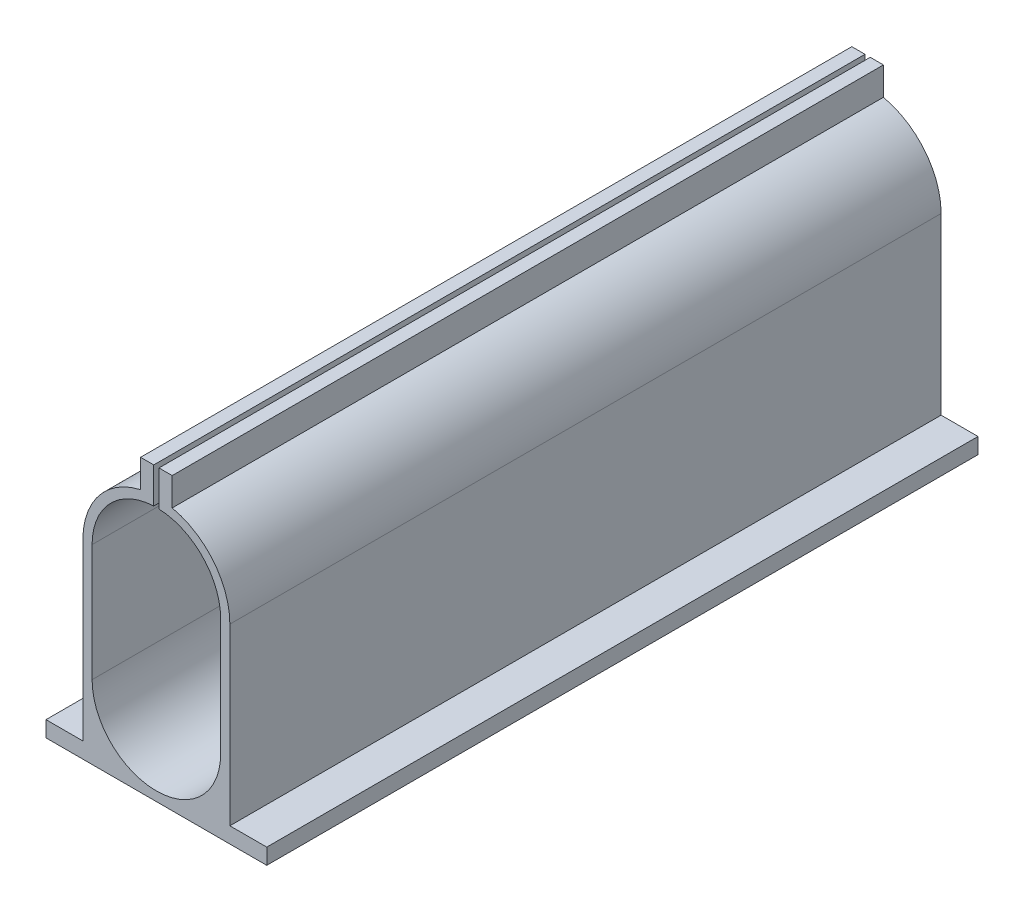
ISO-10303-21;
HEADER;
FILE_DESCRIPTION(('STEP AP214'),'2;1');
FILE_NAME('part.step','',(''),(''),'','','');
FILE_SCHEMA(('AUTOMOTIVE_DESIGN { 1 0 10303 214 1 1 1 1 }'));
ENDSEC;
DATA;
#1=APPLICATION_CONTEXT('core data for automotive mechanical design processes');
#2=APPLICATION_PROTOCOL_DEFINITION('international standard','automotive_design',2000,#1);
#3=PRODUCT_CONTEXT('',#1,'mechanical');
#4=PRODUCT('Part','Part','',(#3));
#5=PRODUCT_RELATED_PRODUCT_CATEGORY('part','',(#4));
#6=PRODUCT_DEFINITION_FORMATION('','',#4);
#7=PRODUCT_DEFINITION_CONTEXT('part definition',#1,'design');
#8=PRODUCT_DEFINITION('design','',#6,#7);
#9=PRODUCT_DEFINITION_SHAPE('','',#8);
#10=(LENGTH_UNIT() NAMED_UNIT(*) SI_UNIT(.MILLI.,.METRE.));
#11=(NAMED_UNIT(*) PLANE_ANGLE_UNIT() SI_UNIT($,.RADIAN.));
#12=(NAMED_UNIT(*) SI_UNIT($,.STERADIAN.) SOLID_ANGLE_UNIT());
#13=UNCERTAINTY_MEASURE_WITH_UNIT(LENGTH_MEASURE(1.E-05),#10,'distance_accuracy_value','');
#14=(GEOMETRIC_REPRESENTATION_CONTEXT(3) GLOBAL_UNCERTAINTY_ASSIGNED_CONTEXT((#13)) GLOBAL_UNIT_ASSIGNED_CONTEXT((#10,
#11,#12)) REPRESENTATION_CONTEXT('',''));
#15=CARTESIAN_POINT('',(0.,0.,0.));
#16=DIRECTION('',(0.,0.,1.));
#17=DIRECTION('',(1.,0.,0.));
#18=AXIS2_PLACEMENT_3D('',#15,#16,#17);
#19=CARTESIAN_POINT('',(0.,11.1,67.5));
#20=DIRECTION('',(0.,0.,-1.));
#21=DIRECTION('',(-1.,0.,0.));
#22=AXIS2_PLACEMENT_3D('',#19,#20,#21);
#23=CYLINDRICAL_SURFACE('',#22,12.2);
#24=DIRECTION('',(0.,0.,-1.));
#25=VECTOR('',#24,1.);
#26=CARTESIAN_POINT('',(-0.499999999999998,23.289749792346,67.5));
#27=LINE('',#26,#25);
#28=CARTESIAN_POINT('',(-0.499999999999998,23.289749792346,67.5));
#29=VERTEX_POINT('',#28);
#30=CARTESIAN_POINT('',(-0.499999999999998,23.289749792346,-64.5));
#31=VERTEX_POINT('',#30);
#32=EDGE_CURVE('E223',#29,#31,#27,.T.);
#33=ORIENTED_EDGE('',*,*,#32,.F.);
#34=CARTESIAN_POINT('',(0.,11.1,67.5));
#35=DIRECTION('',(0.,0.,1.));
#36=DIRECTION('',(1.,0.,0.));
#37=AXIS2_PLACEMENT_3D('',#34,#35,#36);
#38=CIRCLE('',#37,12.2);
#39=CARTESIAN_POINT('',(-12.2,11.1,67.5));
#40=VERTEX_POINT('',#39);
#41=EDGE_CURVE('E261',#29,#40,#38,.T.);
#42=ORIENTED_EDGE('',*,*,#41,.T.);
#43=DIRECTION('',(0.,0.,-1.));
#44=VECTOR('',#43,1.);
#45=CARTESIAN_POINT('',(-12.2,11.1,67.5));
#46=LINE('',#45,#44);
#47=CARTESIAN_POINT('',(-12.2,11.1,-64.5));
#48=VERTEX_POINT('',#47);
#49=EDGE_CURVE('E270',#40,#48,#46,.T.);
#50=ORIENTED_EDGE('',*,*,#49,.T.);
#51=CARTESIAN_POINT('',(0.,11.1,-64.5));
#52=DIRECTION('',(0.,0.,-1.));
#53=DIRECTION('',(-1.,0.,0.));
#54=AXIS2_PLACEMENT_3D('',#51,#52,#53);
#55=CIRCLE('',#54,12.2);
#56=EDGE_CURVE('E248',#48,#31,#55,.T.);
#57=ORIENTED_EDGE('',*,*,#56,.T.);
#58=EDGE_LOOP('',(#33,#42,#50,#57));
#59=FACE_BOUND('',#58,.T.);
#60=ADVANCED_FACE('F33',(#59),#23,.F.);
#61=CARTESIAN_POINT('',(-3.,30.05,-76.5311959340942));
#62=DIRECTION('',(0.,1.,0.));
#63=DIRECTION('',(0.,0.,1.));
#64=AXIS2_PLACEMENT_3D('',#61,#62,#63);
#65=PLANE('',#64);
#66=DIRECTION('',(0.,0.,1.));
#67=VECTOR('',#66,1.);
#68=CARTESIAN_POINT('',(-0.499999999999997,30.05,-67.5));
#69=LINE('',#68,#67);
#70=CARTESIAN_POINT('',(-0.499999999999997,30.05,-67.5));
#71=VERTEX_POINT('',#70);
#72=CARTESIAN_POINT('',(-0.499999999999997,30.05,67.5));
#73=VERTEX_POINT('',#72);
#74=EDGE_CURVE('E212',#71,#73,#69,.T.);
#75=ORIENTED_EDGE('',*,*,#74,.F.);
#76=DIRECTION('',(1.,0.,0.));
#77=VECTOR('',#76,1.);
#78=CARTESIAN_POINT('',(-3.,30.05,-67.5));
#79=LINE('',#78,#77);
#80=CARTESIAN_POINT('',(-3.,30.05,-67.5));
#81=VERTEX_POINT('',#80);
#82=EDGE_CURVE('E205',#81,#71,#79,.T.);
#83=ORIENTED_EDGE('',*,*,#82,.F.);
#84=DIRECTION('',(0.,0.,1.));
#85=VECTOR('',#84,1.);
#86=CARTESIAN_POINT('',(-3.,30.05,-76.5311959340942));
#87=LINE('',#86,#85);
#88=CARTESIAN_POINT('',(-3.,30.05,67.5));
#89=VERTEX_POINT('',#88);
#90=EDGE_CURVE('E230',#81,#89,#87,.T.);
#91=ORIENTED_EDGE('',*,*,#90,.T.);
#92=DIRECTION('',(-1.,0.,0.));
#93=VECTOR('',#92,1.);
#94=CARTESIAN_POINT('',(-3.,30.05,67.5));
#95=LINE('',#94,#93);
#96=EDGE_CURVE('E239',#73,#89,#95,.T.);
#97=ORIENTED_EDGE('',*,*,#96,.F.);
#98=EDGE_LOOP('',(#75,#83,#91,#97));
#99=FACE_BOUND('',#98,.T.);
#100=ADVANCED_FACE('F349',(#99),#65,.T.);
#101=CARTESIAN_POINT('',(0.,11.1,67.5));
#102=DIRECTION('',(0.,0.,-1.));
#103=DIRECTION('',(-1.,0.,0.));
#104=AXIS2_PLACEMENT_3D('',#101,#102,#103);
#105=CYLINDRICAL_SURFACE('',#104,13.95);
#106=CARTESIAN_POINT('',(0.,11.1,67.5));
#107=DIRECTION('',(0.,0.,1.));
#108=DIRECTION('',(1.,0.,0.));
#109=AXIS2_PLACEMENT_3D('',#106,#107,#108);
#110=CIRCLE('',#109,13.95);
#111=CARTESIAN_POINT('',(-3.,24.7236008455914,67.5));
#112=VERTEX_POINT('',#111);
#113=CARTESIAN_POINT('',(-13.95,11.1,67.5));
#114=VERTEX_POINT('',#113);
#115=EDGE_CURVE('E56',#112,#114,#110,.T.);
#116=ORIENTED_EDGE('',*,*,#115,.F.);
#117=DIRECTION('',(0.,0.,-1.));
#118=VECTOR('',#117,1.);
#119=CARTESIAN_POINT('',(-3.,24.7236008455914,67.5));
#120=LINE('',#119,#118);
#121=CARTESIAN_POINT('',(-3.,24.7236008455914,-67.5));
#122=VERTEX_POINT('',#121);
#123=EDGE_CURVE('E41',#112,#122,#120,.T.);
#124=ORIENTED_EDGE('',*,*,#123,.T.);
#125=CARTESIAN_POINT('',(0.,11.1,-67.5));
#126=DIRECTION('',(0.,0.,1.));
#127=DIRECTION('',(1.,0.,0.));
#128=AXIS2_PLACEMENT_3D('',#125,#126,#127);
#129=CIRCLE('',#128,13.95);
#130=CARTESIAN_POINT('',(-13.95,11.1,-67.5));
#131=VERTEX_POINT('',#130);
#132=EDGE_CURVE('E279',#122,#131,#129,.T.);
#133=ORIENTED_EDGE('',*,*,#132,.T.);
#134=DIRECTION('',(0.,0.,-1.));
#135=VECTOR('',#134,1.);
#136=CARTESIAN_POINT('',(-13.95,11.1,67.5));
#137=LINE('',#136,#135);
#138=EDGE_CURVE('E334',#114,#131,#137,.T.);
#139=ORIENTED_EDGE('',*,*,#138,.F.);
#140=EDGE_LOOP('',(#116,#124,#133,#139));
#141=FACE_BOUND('',#140,.T.);
#142=ADVANCED_FACE('F342',(#141),#105,.T.);
#143=CARTESIAN_POINT('',(0.,-11.1,67.5));
#144=DIRECTION('',(0.,0.,-1.));
#145=DIRECTION('',(-1.,0.,0.));
#146=AXIS2_PLACEMENT_3D('',#143,#144,#145);
#147=CYLINDRICAL_SURFACE('',#146,12.2);
#148=DIRECTION('',(0.,0.,-1.));
#149=VECTOR('',#148,1.);
#150=CARTESIAN_POINT('',(12.2,-11.1,67.5));
#151=LINE('',#150,#149);
#152=CARTESIAN_POINT('',(12.2,-11.1,67.5));
#153=VERTEX_POINT('',#152);
#154=CARTESIAN_POINT('',(12.2,-11.1,-64.5));
#155=VERTEX_POINT('',#154);
#156=EDGE_CURVE('E276',#153,#155,#151,.T.);
#157=ORIENTED_EDGE('',*,*,#156,.T.);
#158=CARTESIAN_POINT('',(0.,-11.1,-64.5));
#159=DIRECTION('',(0.,0.,-1.));
#160=DIRECTION('',(-1.,0.,0.));
#161=AXIS2_PLACEMENT_3D('',#158,#159,#160);
#162=CIRCLE('',#161,12.2);
#163=CARTESIAN_POINT('',(-12.2,-11.1,-64.5));
#164=VERTEX_POINT('',#163);
#165=EDGE_CURVE('E254',#155,#164,#162,.T.);
#166=ORIENTED_EDGE('',*,*,#165,.T.);
#167=DIRECTION('',(0.,0.,-1.));
#168=VECTOR('',#167,1.);
#169=CARTESIAN_POINT('',(-12.2,-11.1,67.5));
#170=LINE('',#169,#168);
#171=CARTESIAN_POINT('',(-12.2,-11.1,67.5));
#172=VERTEX_POINT('',#171);
#173=EDGE_CURVE('E267',#172,#164,#170,.T.);
#174=ORIENTED_EDGE('',*,*,#173,.F.);
#175=CARTESIAN_POINT('',(0.,-11.1,67.5));
#176=DIRECTION('',(0.,0.,1.));
#177=DIRECTION('',(1.,0.,0.));
#178=AXIS2_PLACEMENT_3D('',#175,#176,#177);
#179=CIRCLE('',#178,12.2);
#180=EDGE_CURVE('E257',#172,#153,#179,.T.);
#181=ORIENTED_EDGE('',*,*,#180,.T.);
#182=EDGE_LOOP('',(#157,#166,#174,#181));
#183=FACE_BOUND('',#182,.T.);
#184=ADVANCED_FACE('F367',(#183),#147,.F.);
#185=CARTESIAN_POINT('',(12.2,-11.1,67.5));
#186=DIRECTION('',(-1.,0.,0.));
#187=DIRECTION('',(0.,-1.,0.));
#188=AXIS2_PLACEMENT_3D('',#185,#186,#187);
#189=PLANE('',#188);
#190=DIRECTION('',(0.,0.,-1.));
#191=VECTOR('',#190,1.);
#192=CARTESIAN_POINT('',(12.2,11.1,67.5));
#193=LINE('',#192,#191);
#194=CARTESIAN_POINT('',(12.2,11.1,67.5));
#195=VERTEX_POINT('',#194);
#196=CARTESIAN_POINT('',(12.2,11.1,-64.5));
#197=VERTEX_POINT('',#196);
#198=EDGE_CURVE('E273',#195,#197,#193,.T.);
#199=ORIENTED_EDGE('',*,*,#198,.T.);
#200=DIRECTION('',(0.,-1.,0.));
#201=VECTOR('',#200,1.);
#202=CARTESIAN_POINT('',(12.2,-11.1,-64.5));
#203=LINE('',#202,#201);
#204=EDGE_CURVE('E251',#197,#155,#203,.T.);
#205=ORIENTED_EDGE('',*,*,#204,.T.);
#206=ORIENTED_EDGE('',*,*,#156,.F.);
#207=DIRECTION('',(0.,1.,0.));
#208=VECTOR('',#207,1.);
#209=CARTESIAN_POINT('',(12.2,-11.1,67.5));
#210=LINE('',#209,#208);
#211=EDGE_CURVE('E259',#153,#195,#210,.T.);
#212=ORIENTED_EDGE('',*,*,#211,.T.);
#213=EDGE_LOOP('',(#199,#205,#206,#212));
#214=FACE_BOUND('',#213,.T.);
#215=ADVANCED_FACE('F371',(#214),#189,.T.);
#216=DIRECTION('',(0.,0.,-1.));
#217=VECTOR('',#216,1.);
#218=CARTESIAN_POINT('',(0.499999999999998,23.289749792346,67.5));
#219=LINE('',#218,#217);
#220=CARTESIAN_POINT('',(0.499999999999998,23.289749792346,-64.5));
#221=VERTEX_POINT('',#220);
#222=CARTESIAN_POINT('',(0.499999999999998,23.289749792346,67.5));
#223=VERTEX_POINT('',#222);
#224=EDGE_CURVE('E220',#221,#223,#219,.F.);
#225=ORIENTED_EDGE('',*,*,#224,.F.);
#226=EDGE_CURVE('E234',#221,#197,#55,.T.);
#227=ORIENTED_EDGE('',*,*,#226,.T.);
#228=ORIENTED_EDGE('',*,*,#198,.F.);
#229=EDGE_CURVE('E262',#195,#223,#38,.T.);
#230=ORIENTED_EDGE('',*,*,#229,.T.);
#231=EDGE_LOOP('',(#225,#227,#228,#230));
#232=FACE_BOUND('',#231,.T.);
#233=ADVANCED_FACE('F376',(#232),#23,.F.);
#234=CARTESIAN_POINT('',(-12.2,11.1,67.5));
#235=DIRECTION('',(1.,0.,0.));
#236=DIRECTION('',(0.,1.,0.));
#237=AXIS2_PLACEMENT_3D('',#234,#235,#236);
#238=PLANE('',#237);
#239=ORIENTED_EDGE('',*,*,#173,.T.);
#240=DIRECTION('',(0.,1.,0.));
#241=VECTOR('',#240,1.);
#242=CARTESIAN_POINT('',(-12.2,11.1,-64.5));
#243=LINE('',#242,#241);
#244=EDGE_CURVE('E337',#164,#48,#243,.T.);
#245=ORIENTED_EDGE('',*,*,#244,.T.);
#246=ORIENTED_EDGE('',*,*,#49,.F.);
#247=DIRECTION('',(0.,-1.,0.));
#248=VECTOR('',#247,1.);
#249=CARTESIAN_POINT('',(-12.2,11.1,67.5));
#250=LINE('',#249,#248);
#251=EDGE_CURVE('E265',#40,#172,#250,.T.);
#252=ORIENTED_EDGE('',*,*,#251,.T.);
#253=EDGE_LOOP('',(#239,#245,#246,#252));
#254=FACE_BOUND('',#253,.T.);
#255=ADVANCED_FACE('F361',(#254),#238,.T.);
#256=CARTESIAN_POINT('',(0.,11.1,67.5));
#257=DIRECTION('',(0.,0.,1.));
#258=DIRECTION('',(1.,0.,0.));
#259=AXIS2_PLACEMENT_3D('',#256,#257,#258);
#260=PLANE('',#259);
#261=DIRECTION('',(0.,-1.,0.));
#262=VECTOR('',#261,1.);
#263=CARTESIAN_POINT('',(-0.499999999999997,30.05,67.5));
#264=LINE('',#263,#262);
#265=EDGE_CURVE('E207',#73,#29,#264,.T.);
#266=ORIENTED_EDGE('',*,*,#265,.F.);
#267=ORIENTED_EDGE('',*,*,#96,.T.);
#268=DIRECTION('',(0.,-1.,0.));
#269=VECTOR('',#268,1.);
#270=CARTESIAN_POINT('',(-3.,23.3,67.5));
#271=LINE('',#270,#269);
#272=EDGE_CURVE('E225',#89,#112,#271,.T.);
#273=ORIENTED_EDGE('',*,*,#272,.T.);
#274=ORIENTED_EDGE('',*,*,#115,.T.);
#275=DIRECTION('',(0.,-1.,0.));
#276=VECTOR('',#275,1.);
#277=CARTESIAN_POINT('',(-13.95,11.1,67.5));
#278=LINE('',#277,#276);
#279=CARTESIAN_POINT('',(-13.95,-22.05,67.5));
#280=VERTEX_POINT('',#279);
#281=EDGE_CURVE('E283',#114,#280,#278,.T.);
#282=ORIENTED_EDGE('',*,*,#281,.T.);
#283=DIRECTION('',(-1.,0.,0.));
#284=VECTOR('',#283,1.);
#285=CARTESIAN_POINT('',(-13.95,-22.05,67.5));
#286=LINE('',#285,#284);
#287=CARTESIAN_POINT('',(-20.95,-22.05,67.5));
#288=VERTEX_POINT('',#287);
#289=EDGE_CURVE('E285',#280,#288,#286,.T.);
#290=ORIENTED_EDGE('',*,*,#289,.T.);
#291=DIRECTION('',(0.,-1.,0.));
#292=VECTOR('',#291,1.);
#293=CARTESIAN_POINT('',(-20.95,-22.05,67.5));
#294=LINE('',#293,#292);
#295=CARTESIAN_POINT('',(-20.95,-25.05,67.5));
#296=VERTEX_POINT('',#295);
#297=EDGE_CURVE('E287',#288,#296,#294,.T.);
#298=ORIENTED_EDGE('',*,*,#297,.T.);
#299=DIRECTION('',(1.,0.,0.));
#300=VECTOR('',#299,1.);
#301=CARTESIAN_POINT('',(-20.95,-25.05,67.5));
#302=LINE('',#301,#300);
#303=CARTESIAN_POINT('',(20.95,-25.05,67.5));
#304=VERTEX_POINT('',#303);
#305=EDGE_CURVE('E289',#296,#304,#302,.T.);
#306=ORIENTED_EDGE('',*,*,#305,.T.);
#307=DIRECTION('',(0.,1.,0.));
#308=VECTOR('',#307,1.);
#309=CARTESIAN_POINT('',(20.95,-25.05,67.5));
#310=LINE('',#309,#308);
#311=CARTESIAN_POINT('',(20.95,-22.05,67.5));
#312=VERTEX_POINT('',#311);
#313=EDGE_CURVE('E291',#304,#312,#310,.T.);
#314=ORIENTED_EDGE('',*,*,#313,.T.);
#315=DIRECTION('',(-1.,0.,0.));
#316=VECTOR('',#315,1.);
#317=CARTESIAN_POINT('',(20.95,-22.05,67.5));
#318=LINE('',#317,#316);
#319=CARTESIAN_POINT('',(13.95,-22.05,67.5));
#320=VERTEX_POINT('',#319);
#321=EDGE_CURVE('E293',#312,#320,#318,.T.);
#322=ORIENTED_EDGE('',*,*,#321,.T.);
#323=DIRECTION('',(0.,1.,0.));
#324=VECTOR('',#323,1.);
#325=CARTESIAN_POINT('',(13.95,-22.05,67.5));
#326=LINE('',#325,#324);
#327=CARTESIAN_POINT('',(13.95,11.1,67.5));
#328=VERTEX_POINT('',#327);
#329=EDGE_CURVE('E295',#320,#328,#326,.T.);
#330=ORIENTED_EDGE('',*,*,#329,.T.);
#331=CARTESIAN_POINT('',(3.,24.7236008455914,67.5));
#332=VERTEX_POINT('',#331);
#333=EDGE_CURVE('E280',#328,#332,#110,.T.);
#334=ORIENTED_EDGE('',*,*,#333,.T.);
#335=DIRECTION('',(0.,1.,0.));
#336=VECTOR('',#335,1.);
#337=CARTESIAN_POINT('',(3.,23.3,67.5));
#338=LINE('',#337,#336);
#339=CARTESIAN_POINT('',(3.,30.05,67.5));
#340=VERTEX_POINT('',#339);
#341=EDGE_CURVE('E237',#332,#340,#338,.T.);
#342=ORIENTED_EDGE('',*,*,#341,.T.);
#343=CARTESIAN_POINT('',(0.500000000000001,30.05,67.5));
#344=VERTEX_POINT('',#343);
#345=EDGE_CURVE('E240',#340,#344,#95,.T.);
#346=ORIENTED_EDGE('',*,*,#345,.T.);
#347=DIRECTION('',(0.,1.,0.));
#348=VECTOR('',#347,1.);
#349=CARTESIAN_POINT('',(0.499999999999997,30.05,67.5));
#350=LINE('',#349,#348);
#351=EDGE_CURVE('E48',#223,#344,#350,.T.);
#352=ORIENTED_EDGE('',*,*,#351,.F.);
#353=ORIENTED_EDGE('',*,*,#229,.F.);
#354=ORIENTED_EDGE('',*,*,#211,.F.);
#355=ORIENTED_EDGE('',*,*,#180,.F.);
#356=ORIENTED_EDGE('',*,*,#251,.F.);
#357=ORIENTED_EDGE('',*,*,#41,.F.);
#358=EDGE_LOOP('',(#266,#267,#273,#274,#282,#290,#298,#306,#314,#322,#330,#334,#342,#346,#352,
#353,#354,#355,#356,#357));
#359=FACE_BOUND('',#358,.T.);
#360=ADVANCED_FACE('F355',(#359),#260,.T.);
#361=CARTESIAN_POINT('',(0.,11.1,-67.5));
#362=DIRECTION('',(0.,0.,1.));
#363=DIRECTION('',(1.,0.,0.));
#364=AXIS2_PLACEMENT_3D('',#361,#362,#363);
#365=PLANE('',#364);
#366=ORIENTED_EDGE('',*,*,#82,.T.);
#367=DIRECTION('',(0.,-1.,0.));
#368=VECTOR('',#367,1.);
#369=CARTESIAN_POINT('',(-0.499999999999997,30.05,-67.5));
#370=LINE('',#369,#368);
#371=CARTESIAN_POINT('',(-0.499999999999999,-10.,-67.5));
#372=VERTEX_POINT('',#371);
#373=EDGE_CURVE('E186',#71,#372,#370,.T.);
#374=ORIENTED_EDGE('',*,*,#373,.T.);
#375=DIRECTION('',(1.,0.,0.));
#376=VECTOR('',#375,1.);
#377=CARTESIAN_POINT('',(-0.499999999999999,-10.,-67.5));
#378=LINE('',#377,#376);
#379=CARTESIAN_POINT('',(0.500000000000001,-10.,-67.5));
#380=VERTEX_POINT('',#379);
#381=EDGE_CURVE('E195',#372,#380,#378,.T.);
#382=ORIENTED_EDGE('',*,*,#381,.T.);
#383=DIRECTION('',(0.,1.,0.));
#384=VECTOR('',#383,1.);
#385=CARTESIAN_POINT('',(0.499999999999997,30.05,-67.5));
#386=LINE('',#385,#384);
#387=CARTESIAN_POINT('',(0.499999999999997,30.05,-67.5));
#388=VERTEX_POINT('',#387);
#389=EDGE_CURVE('E192',#380,#388,#386,.T.);
#390=ORIENTED_EDGE('',*,*,#389,.T.);
#391=CARTESIAN_POINT('',(3.,30.05,-67.5));
#392=VERTEX_POINT('',#391);
#393=EDGE_CURVE('E229',#388,#392,#79,.T.);
#394=ORIENTED_EDGE('',*,*,#393,.T.);
#395=DIRECTION('',(0.,-1.,0.));
#396=VECTOR('',#395,1.);
#397=CARTESIAN_POINT('',(3.,23.3,-67.5));
#398=LINE('',#397,#396);
#399=CARTESIAN_POINT('',(3.,24.7236008455914,-67.5));
#400=VERTEX_POINT('',#399);
#401=EDGE_CURVE('E226',#392,#400,#398,.T.);
#402=ORIENTED_EDGE('',*,*,#401,.T.);
#403=CARTESIAN_POINT('',(13.95,11.1,-67.5));
#404=VERTEX_POINT('',#403);
#405=EDGE_CURVE('E298',#404,#400,#129,.T.);
#406=ORIENTED_EDGE('',*,*,#405,.F.);
#407=DIRECTION('',(0.,1.,0.));
#408=VECTOR('',#407,1.);
#409=CARTESIAN_POINT('',(13.95,-11.1,-67.5));
#410=LINE('',#409,#408);
#411=CARTESIAN_POINT('',(13.95,-22.05,-67.5));
#412=VERTEX_POINT('',#411);
#413=EDGE_CURVE('E318',#412,#404,#410,.T.);
#414=ORIENTED_EDGE('',*,*,#413,.F.);
#415=DIRECTION('',(-1.,0.,0.));
#416=VECTOR('',#415,1.);
#417=CARTESIAN_POINT('',(20.95,-22.05,-67.5));
#418=LINE('',#417,#416);
#419=CARTESIAN_POINT('',(20.95,-22.05,-67.5));
#420=VERTEX_POINT('',#419);
#421=EDGE_CURVE('E315',#420,#412,#418,.T.);
#422=ORIENTED_EDGE('',*,*,#421,.F.);
#423=DIRECTION('',(0.,1.,0.));
#424=VECTOR('',#423,1.);
#425=CARTESIAN_POINT('',(20.95,-25.05,-67.5));
#426=LINE('',#425,#424);
#427=CARTESIAN_POINT('',(20.95,-25.05,-67.5));
#428=VERTEX_POINT('',#427);
#429=EDGE_CURVE('E312',#428,#420,#426,.T.);
#430=ORIENTED_EDGE('',*,*,#429,.F.);
#431=DIRECTION('',(1.,0.,0.));
#432=VECTOR('',#431,1.);
#433=CARTESIAN_POINT('',(-20.95,-25.05,-67.5));
#434=LINE('',#433,#432);
#435=CARTESIAN_POINT('',(-20.95,-25.05,-67.5));
#436=VERTEX_POINT('',#435);
#437=EDGE_CURVE('E309',#436,#428,#434,.T.);
#438=ORIENTED_EDGE('',*,*,#437,.F.);
#439=DIRECTION('',(0.,-1.,0.));
#440=VECTOR('',#439,1.);
#441=CARTESIAN_POINT('',(-20.95,-22.05,-67.5));
#442=LINE('',#441,#440);
#443=CARTESIAN_POINT('',(-20.95,-22.05,-67.5));
#444=VERTEX_POINT('',#443);
#445=EDGE_CURVE('E306',#444,#436,#442,.T.);
#446=ORIENTED_EDGE('',*,*,#445,.F.);
#447=DIRECTION('',(-1.,0.,0.));
#448=VECTOR('',#447,1.);
#449=CARTESIAN_POINT('',(-13.95,-22.05,-67.5));
#450=LINE('',#449,#448);
#451=CARTESIAN_POINT('',(-13.95,-22.05,-67.5));
#452=VERTEX_POINT('',#451);
#453=EDGE_CURVE('E303',#452,#444,#450,.T.);
#454=ORIENTED_EDGE('',*,*,#453,.F.);
#455=DIRECTION('',(0.,-1.,0.));
#456=VECTOR('',#455,1.);
#457=CARTESIAN_POINT('',(-13.95,-11.1,-67.5));
#458=LINE('',#457,#456);
#459=EDGE_CURVE('E300',#131,#452,#458,.T.);
#460=ORIENTED_EDGE('',*,*,#459,.F.);
#461=ORIENTED_EDGE('',*,*,#132,.F.);
#462=DIRECTION('',(0.,1.,0.));
#463=VECTOR('',#462,1.);
#464=CARTESIAN_POINT('',(-3.,23.3,-67.5));
#465=LINE('',#464,#463);
#466=EDGE_CURVE('E232',#122,#81,#465,.T.);
#467=ORIENTED_EDGE('',*,*,#466,.T.);
#468=EDGE_LOOP('',(#366,#374,#382,#390,#394,#402,#406,#414,#422,#430,#438,#446,#454,#460,#461,#467));
#469=FACE_BOUND('',#468,.T.);
#470=ADVANCED_FACE('F203',(#469),#365,.F.);
#471=ORIENTED_EDGE('',*,*,#405,.T.);
#472=DIRECTION('',(0.,0.,-1.));
#473=VECTOR('',#472,1.);
#474=CARTESIAN_POINT('',(3.,24.7236008455914,67.5));
#475=LINE('',#474,#473);
#476=EDGE_CURVE('E340',#400,#332,#475,.F.);
#477=ORIENTED_EDGE('',*,*,#476,.T.);
#478=ORIENTED_EDGE('',*,*,#333,.F.);
#479=DIRECTION('',(0.,0.,-1.));
#480=VECTOR('',#479,1.);
#481=CARTESIAN_POINT('',(13.95,11.1,67.5));
#482=LINE('',#481,#480);
#483=EDGE_CURVE('E297',#328,#404,#482,.T.);
#484=ORIENTED_EDGE('',*,*,#483,.T.);
#485=EDGE_LOOP('',(#471,#477,#478,#484));
#486=FACE_BOUND('',#485,.T.);
#487=ADVANCED_FACE('F35',(#486),#105,.T.);
#488=CARTESIAN_POINT('',(-13.95,-11.1,67.5));
#489=DIRECTION('',(1.,0.,0.));
#490=DIRECTION('',(0.,1.,0.));
#491=AXIS2_PLACEMENT_3D('',#488,#489,#490);
#492=PLANE('',#491);
#493=ORIENTED_EDGE('',*,*,#459,.T.);
#494=DIRECTION('',(0.,0.,-1.));
#495=VECTOR('',#494,1.);
#496=CARTESIAN_POINT('',(-13.95,-22.05,67.5));
#497=LINE('',#496,#495);
#498=EDGE_CURVE('E332',#280,#452,#497,.T.);
#499=ORIENTED_EDGE('',*,*,#498,.F.);
#500=ORIENTED_EDGE('',*,*,#281,.F.);
#501=ORIENTED_EDGE('',*,*,#138,.T.);
#502=EDGE_LOOP('',(#493,#499,#500,#501));
#503=FACE_BOUND('',#502,.T.);
#504=ADVANCED_FACE('F425',(#503),#492,.F.);
#505=CARTESIAN_POINT('',(-13.95,-22.05,67.5));
#506=DIRECTION('',(0.,-1.,0.));
#507=DIRECTION('',(0.,0.,-1.));
#508=AXIS2_PLACEMENT_3D('',#505,#506,#507);
#509=PLANE('',#508);
#510=ORIENTED_EDGE('',*,*,#453,.T.);
#511=DIRECTION('',(0.,0.,-1.));
#512=VECTOR('',#511,1.);
#513=CARTESIAN_POINT('',(-20.95,-22.05,67.5));
#514=LINE('',#513,#512);
#515=EDGE_CURVE('E330',#288,#444,#514,.T.);
#516=ORIENTED_EDGE('',*,*,#515,.F.);
#517=ORIENTED_EDGE('',*,*,#289,.F.);
#518=ORIENTED_EDGE('',*,*,#498,.T.);
#519=EDGE_LOOP('',(#510,#516,#517,#518));
#520=FACE_BOUND('',#519,.T.);
#521=ADVANCED_FACE('F420',(#520),#509,.F.);
#522=CARTESIAN_POINT('',(-20.95,-22.05,67.5));
#523=DIRECTION('',(1.,0.,0.));
#524=DIRECTION('',(0.,0.,-1.));
#525=AXIS2_PLACEMENT_3D('',#522,#523,#524);
#526=PLANE('',#525);
#527=ORIENTED_EDGE('',*,*,#445,.T.);
#528=DIRECTION('',(0.,0.,-1.));
#529=VECTOR('',#528,1.);
#530=CARTESIAN_POINT('',(-20.95,-25.05,67.5));
#531=LINE('',#530,#529);
#532=EDGE_CURVE('E328',#296,#436,#531,.T.);
#533=ORIENTED_EDGE('',*,*,#532,.F.);
#534=ORIENTED_EDGE('',*,*,#297,.F.);
#535=ORIENTED_EDGE('',*,*,#515,.T.);
#536=EDGE_LOOP('',(#527,#533,#534,#535));
#537=FACE_BOUND('',#536,.T.);
#538=ADVANCED_FACE('F416',(#537),#526,.F.);
#539=CARTESIAN_POINT('',(-20.95,-25.05,67.5));
#540=DIRECTION('',(0.,1.,0.));
#541=DIRECTION('',(0.,0.,1.));
#542=AXIS2_PLACEMENT_3D('',#539,#540,#541);
#543=PLANE('',#542);
#544=ORIENTED_EDGE('',*,*,#437,.T.);
#545=DIRECTION('',(0.,0.,-1.));
#546=VECTOR('',#545,1.);
#547=CARTESIAN_POINT('',(20.95,-25.05,67.5));
#548=LINE('',#547,#546);
#549=EDGE_CURVE('E326',#304,#428,#548,.T.);
#550=ORIENTED_EDGE('',*,*,#549,.F.);
#551=ORIENTED_EDGE('',*,*,#305,.F.);
#552=ORIENTED_EDGE('',*,*,#532,.T.);
#553=EDGE_LOOP('',(#544,#550,#551,#552));
#554=FACE_BOUND('',#553,.T.);
#555=ADVANCED_FACE('F412',(#554),#543,.F.);
#556=CARTESIAN_POINT('',(20.95,-25.05,67.5));
#557=DIRECTION('',(-1.,0.,0.));
#558=DIRECTION('',(0.,0.,1.));
#559=AXIS2_PLACEMENT_3D('',#556,#557,#558);
#560=PLANE('',#559);
#561=ORIENTED_EDGE('',*,*,#429,.T.);
#562=DIRECTION('',(0.,0.,-1.));
#563=VECTOR('',#562,1.);
#564=CARTESIAN_POINT('',(20.95,-22.05,67.5));
#565=LINE('',#564,#563);
#566=EDGE_CURVE('E324',#312,#420,#565,.T.);
#567=ORIENTED_EDGE('',*,*,#566,.F.);
#568=ORIENTED_EDGE('',*,*,#313,.F.);
#569=ORIENTED_EDGE('',*,*,#549,.T.);
#570=EDGE_LOOP('',(#561,#567,#568,#569));
#571=FACE_BOUND('',#570,.T.);
#572=ADVANCED_FACE('F407',(#571),#560,.F.);
#573=CARTESIAN_POINT('',(20.95,-22.05,67.5));
#574=DIRECTION('',(0.,-1.,0.));
#575=DIRECTION('',(0.,0.,-1.));
#576=AXIS2_PLACEMENT_3D('',#573,#574,#575);
#577=PLANE('',#576);
#578=ORIENTED_EDGE('',*,*,#421,.T.);
#579=DIRECTION('',(0.,0.,-1.));
#580=VECTOR('',#579,1.);
#581=CARTESIAN_POINT('',(13.95,-22.05,67.5));
#582=LINE('',#581,#580);
#583=EDGE_CURVE('E322',#320,#412,#582,.T.);
#584=ORIENTED_EDGE('',*,*,#583,.F.);
#585=ORIENTED_EDGE('',*,*,#321,.F.);
#586=ORIENTED_EDGE('',*,*,#566,.T.);
#587=EDGE_LOOP('',(#578,#584,#585,#586));
#588=FACE_BOUND('',#587,.T.);
#589=ADVANCED_FACE('F401',(#588),#577,.F.);
#590=CARTESIAN_POINT('',(13.95,-11.1,67.5));
#591=DIRECTION('',(-1.,0.,0.));
#592=DIRECTION('',(0.,-1.,0.));
#593=AXIS2_PLACEMENT_3D('',#590,#591,#592);
#594=PLANE('',#593);
#595=ORIENTED_EDGE('',*,*,#413,.T.);
#596=ORIENTED_EDGE('',*,*,#483,.F.);
#597=ORIENTED_EDGE('',*,*,#329,.F.);
#598=ORIENTED_EDGE('',*,*,#583,.T.);
#599=EDGE_LOOP('',(#595,#596,#597,#598));
#600=FACE_BOUND('',#599,.T.);
#601=ADVANCED_FACE('F397',(#600),#594,.F.);
#602=CARTESIAN_POINT('',(0.,11.1,-64.5));
#603=DIRECTION('',(0.,0.,-1.));
#604=DIRECTION('',(-1.,0.,0.));
#605=AXIS2_PLACEMENT_3D('',#602,#603,#604);
#606=PLANE('',#605);
#607=DIRECTION('',(-1.,0.,0.));
#608=VECTOR('',#607,1.);
#609=CARTESIAN_POINT('',(0.,-10.,-64.5));
#610=LINE('',#609,#608);
#611=CARTESIAN_POINT('',(0.500000000000001,-10.,-64.5));
#612=VERTEX_POINT('',#611);
#613=CARTESIAN_POINT('',(-0.499999999999999,-10.,-64.5));
#614=VERTEX_POINT('',#613);
#615=EDGE_CURVE('E11',#612,#614,#610,.T.);
#616=ORIENTED_EDGE('',*,*,#615,.T.);
#617=DIRECTION('',(0.,1.,0.));
#618=VECTOR('',#617,1.);
#619=CARTESIAN_POINT('',(-0.499999999999998,11.1,-64.5));
#620=LINE('',#619,#618);
#621=EDGE_CURVE('E189',#614,#31,#620,.T.);
#622=ORIENTED_EDGE('',*,*,#621,.T.);
#623=ORIENTED_EDGE('',*,*,#56,.F.);
#624=ORIENTED_EDGE('',*,*,#244,.F.);
#625=ORIENTED_EDGE('',*,*,#165,.F.);
#626=ORIENTED_EDGE('',*,*,#204,.F.);
#627=ORIENTED_EDGE('',*,*,#226,.F.);
#628=DIRECTION('',(0.,-1.,0.));
#629=VECTOR('',#628,1.);
#630=CARTESIAN_POINT('',(0.499999999999999,11.1,-64.5));
#631=LINE('',#630,#629);
#632=EDGE_CURVE('E214',#221,#612,#631,.T.);
#633=ORIENTED_EDGE('',*,*,#632,.T.);
#634=EDGE_LOOP('',(#616,#622,#623,#624,#625,#626,#627,#633));
#635=FACE_BOUND('',#634,.T.);
#636=ADVANCED_FACE('F364',(#635),#606,.F.);
#637=CARTESIAN_POINT('',(-3.,23.3,-76.5311959340942));
#638=DIRECTION('',(-1.,0.,0.));
#639=DIRECTION('',(0.,0.,1.));
#640=AXIS2_PLACEMENT_3D('',#637,#638,#639);
#641=PLANE('',#640);
#642=ORIENTED_EDGE('',*,*,#123,.F.);
#643=ORIENTED_EDGE('',*,*,#272,.F.);
#644=ORIENTED_EDGE('',*,*,#90,.F.);
#645=ORIENTED_EDGE('',*,*,#466,.F.);
#646=EDGE_LOOP('',(#642,#643,#644,#645));
#647=FACE_BOUND('',#646,.T.);
#648=ADVANCED_FACE('F346',(#647),#641,.T.);
#649=CARTESIAN_POINT('',(3.,23.3,-76.5311959340942));
#650=DIRECTION('',(1.,0.,0.));
#651=DIRECTION('',(0.,0.,-1.));
#652=AXIS2_PLACEMENT_3D('',#649,#650,#651);
#653=PLANE('',#652);
#654=ORIENTED_EDGE('',*,*,#476,.F.);
#655=ORIENTED_EDGE('',*,*,#401,.F.);
#656=DIRECTION('',(0.,0.,1.));
#657=VECTOR('',#656,1.);
#658=CARTESIAN_POINT('',(3.,30.05,-76.5311959340942));
#659=LINE('',#658,#657);
#660=EDGE_CURVE('E243',#392,#340,#659,.T.);
#661=ORIENTED_EDGE('',*,*,#660,.T.);
#662=ORIENTED_EDGE('',*,*,#341,.F.);
#663=EDGE_LOOP('',(#654,#655,#661,#662));
#664=FACE_BOUND('',#663,.T.);
#665=ADVANCED_FACE('F388',(#664),#653,.T.);
#666=DIRECTION('',(0.,0.,1.));
#667=VECTOR('',#666,1.);
#668=CARTESIAN_POINT('',(0.499999999999997,30.05,-67.5));
#669=LINE('',#668,#667);
#670=EDGE_CURVE('E215',#388,#344,#669,.T.);
#671=ORIENTED_EDGE('',*,*,#670,.T.);
#672=ORIENTED_EDGE('',*,*,#345,.F.);
#673=ORIENTED_EDGE('',*,*,#660,.F.);
#674=ORIENTED_EDGE('',*,*,#393,.F.);
#675=EDGE_LOOP('',(#671,#672,#673,#674));
#676=FACE_BOUND('',#675,.T.);
#677=ADVANCED_FACE('F383',(#676),#65,.T.);
#678=CARTESIAN_POINT('',(-0.499999999999999,-10.,-67.5));
#679=DIRECTION('',(0.,-1.,0.));
#680=DIRECTION('',(0.,0.,-1.));
#681=AXIS2_PLACEMENT_3D('',#678,#679,#680);
#682=PLANE('',#681);
#683=DIRECTION('',(0.,0.,1.));
#684=VECTOR('',#683,1.);
#685=CARTESIAN_POINT('',(0.500000000000001,-10.,-67.5));
#686=LINE('',#685,#684);
#687=EDGE_CURVE('E191',#380,#612,#686,.T.);
#688=ORIENTED_EDGE('',*,*,#687,.F.);
#689=ORIENTED_EDGE('',*,*,#381,.F.);
#690=DIRECTION('',(0.,0.,1.));
#691=VECTOR('',#690,1.);
#692=CARTESIAN_POINT('',(-0.499999999999999,-10.,-67.5));
#693=LINE('',#692,#691);
#694=EDGE_CURVE('E182',#372,#614,#693,.T.);
#695=ORIENTED_EDGE('',*,*,#694,.T.);
#696=ORIENTED_EDGE('',*,*,#615,.F.);
#697=EDGE_LOOP('',(#688,#689,#695,#696));
#698=FACE_BOUND('',#697,.T.);
#699=ADVANCED_FACE('F196',(#698),#682,.F.);
#700=CARTESIAN_POINT('',(-0.499999999999997,30.05,-67.5));
#701=DIRECTION('',(-1.,0.,0.));
#702=DIRECTION('',(0.,-1.,0.));
#703=AXIS2_PLACEMENT_3D('',#700,#701,#702);
#704=PLANE('',#703);
#705=ORIENTED_EDGE('',*,*,#32,.T.);
#706=ORIENTED_EDGE('',*,*,#621,.F.);
#707=ORIENTED_EDGE('',*,*,#694,.F.);
#708=ORIENTED_EDGE('',*,*,#373,.F.);
#709=ORIENTED_EDGE('',*,*,#74,.T.);
#710=ORIENTED_EDGE('',*,*,#265,.T.);
#711=EDGE_LOOP('',(#705,#706,#707,#708,#709,#710));
#712=FACE_BOUND('',#711,.T.);
#713=ADVANCED_FACE('F184',(#712),#704,.F.);
#714=CARTESIAN_POINT('',(0.499999999999997,30.05,-67.5));
#715=DIRECTION('',(1.,0.,0.));
#716=DIRECTION('',(0.,1.,0.));
#717=AXIS2_PLACEMENT_3D('',#714,#715,#716);
#718=PLANE('',#717);
#719=ORIENTED_EDGE('',*,*,#224,.T.);
#720=ORIENTED_EDGE('',*,*,#351,.T.);
#721=ORIENTED_EDGE('',*,*,#670,.F.);
#722=ORIENTED_EDGE('',*,*,#389,.F.);
#723=ORIENTED_EDGE('',*,*,#687,.T.);
#724=ORIENTED_EDGE('',*,*,#632,.F.);
#725=EDGE_LOOP('',(#719,#720,#721,#722,#723,#724));
#726=FACE_BOUND('',#725,.T.);
#727=ADVANCED_FACE('F378',(#726),#718,.F.);
#728=CLOSED_SHELL('',(#60,#100,#142,#184,#215,#233,#255,#360,#470,#487,#504,#521,#538,#555,#572,
#589,#601,#636,#648,#665,#677,#699,#713,#727));
#729=MANIFOLD_SOLID_BREP('B2',#728);
#730=ADVANCED_BREP_SHAPE_REPRESENTATION('',(#18,#729),#14);
#731=SHAPE_DEFINITION_REPRESENTATION(#9,#730);
ENDSEC;
END-ISO-10303-21;
